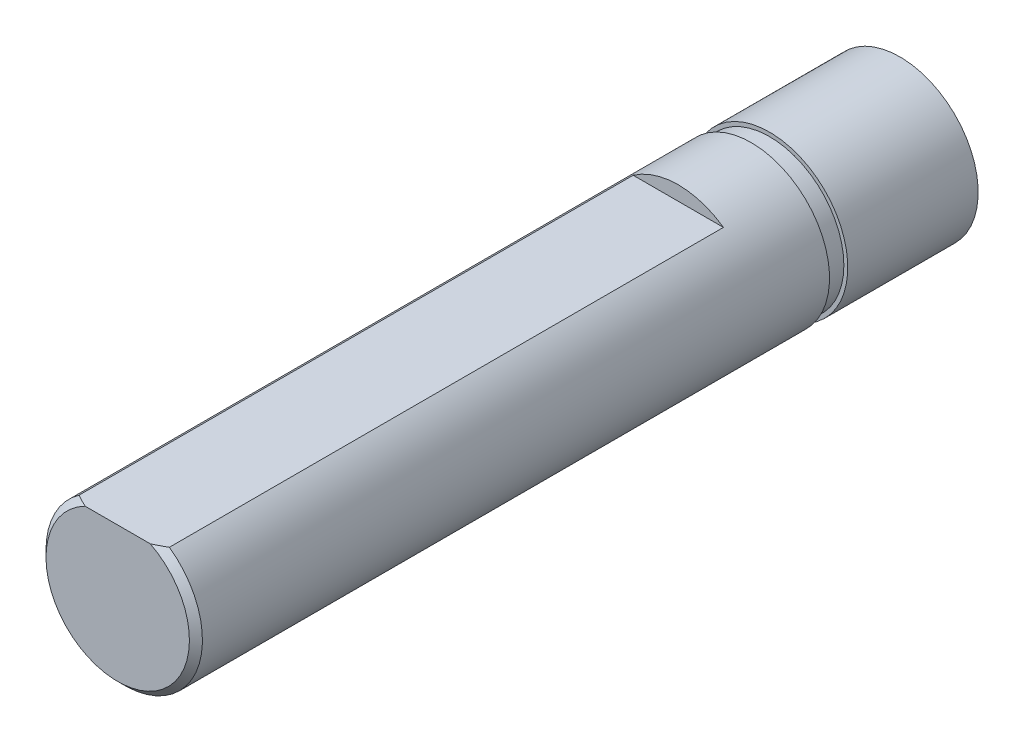
ISO-10303-21;
HEADER;
FILE_DESCRIPTION(('STEP AP214'),'2;1');
FILE_NAME('part.step','',(''),(''),'','','');
FILE_SCHEMA(('AUTOMOTIVE_DESIGN { 1 0 10303 214 1 1 1 1 }'));
ENDSEC;
DATA;
#1=APPLICATION_CONTEXT('core data for automotive mechanical design processes');
#2=APPLICATION_PROTOCOL_DEFINITION('international standard','automotive_design',2000,#1);
#3=PRODUCT_CONTEXT('',#1,'mechanical');
#4=PRODUCT('Part','Part','',(#3));
#5=PRODUCT_RELATED_PRODUCT_CATEGORY('part','',(#4));
#6=PRODUCT_DEFINITION_FORMATION('','',#4);
#7=PRODUCT_DEFINITION_CONTEXT('part definition',#1,'design');
#8=PRODUCT_DEFINITION('design','',#6,#7);
#9=PRODUCT_DEFINITION_SHAPE('','',#8);
#10=(LENGTH_UNIT() NAMED_UNIT(*) SI_UNIT(.MILLI.,.METRE.));
#11=(NAMED_UNIT(*) PLANE_ANGLE_UNIT() SI_UNIT($,.RADIAN.));
#12=(NAMED_UNIT(*) SI_UNIT($,.STERADIAN.) SOLID_ANGLE_UNIT());
#13=UNCERTAINTY_MEASURE_WITH_UNIT(LENGTH_MEASURE(1.E-05),#10,'distance_accuracy_value','');
#14=(GEOMETRIC_REPRESENTATION_CONTEXT(3) GLOBAL_UNCERTAINTY_ASSIGNED_CONTEXT((#13)) GLOBAL_UNIT_ASSIGNED_CONTEXT((#10,
#11,#12)) REPRESENTATION_CONTEXT('',''));
#15=CARTESIAN_POINT('',(0.,0.,0.));
#16=DIRECTION('',(0.,0.,1.));
#17=DIRECTION('',(1.,0.,0.));
#18=AXIS2_PLACEMENT_3D('',#15,#16,#17);
#19=CARTESIAN_POINT('',(0.,0.,0.));
#20=DIRECTION('',(0.,0.,1.));
#21=DIRECTION('',(1.,0.,0.));
#22=AXIS2_PLACEMENT_3D('',#19,#20,#21);
#23=PLANE('',#22);
#24=CARTESIAN_POINT('',(0.,0.,0.));
#25=DIRECTION('',(0.,0.,-1.));
#26=DIRECTION('',(-1.,0.,0.));
#27=AXIS2_PLACEMENT_3D('',#24,#25,#26);
#28=CIRCLE('',#27,3.);
#29=CARTESIAN_POINT('',(-3.,0.,0.));
#30=VERTEX_POINT('',#29);
#31=EDGE_CURVE('E20',#30,#30,#28,.F.);
#32=ORIENTED_EDGE('',*,*,#31,.F.);
#33=EDGE_LOOP('',(#32));
#34=FACE_BOUND('',#33,.T.);
#35=ADVANCED_FACE('F17',(#34),#23,.F.);
#36=CARTESIAN_POINT('',(0.,0.,30.));
#37=DIRECTION('',(0.,0.,-1.));
#38=DIRECTION('',(-1.,0.,0.));
#39=AXIS2_PLACEMENT_3D('',#36,#37,#38);
#40=CYLINDRICAL_SURFACE('',#39,3.);
#41=ORIENTED_EDGE('',*,*,#31,.T.);
#42=EDGE_LOOP('',(#41));
#43=FACE_BOUND('',#42,.T.);
#44=CARTESIAN_POINT('',(0.,0.,5.));
#45=DIRECTION('',(0.,0.,-1.));
#46=DIRECTION('',(-1.,0.,0.));
#47=AXIS2_PLACEMENT_3D('',#44,#45,#46);
#48=CIRCLE('',#47,3.);
#49=CARTESIAN_POINT('',(-3.,0.,5.));
#50=VERTEX_POINT('',#49);
#51=EDGE_CURVE('E131',#50,#50,#48,.T.);
#52=ORIENTED_EDGE('',*,*,#51,.T.);
#53=EDGE_LOOP('',(#52));
#54=FACE_BOUND('',#53,.T.);
#55=ADVANCED_FACE('F104',(#43,#54),#40,.T.);
#56=CARTESIAN_POINT('',(0.,-3.15,5.));
#57=DIRECTION('',(0.,0.,-1.));
#58=DIRECTION('',(-1.,0.,0.));
#59=AXIS2_PLACEMENT_3D('',#56,#57,#58);
#60=PLANE('',#59);
#61=CARTESIAN_POINT('',(0.,0.,5.));
#62=DIRECTION('',(0.,0.,1.));
#63=DIRECTION('',(1.,0.,0.));
#64=AXIS2_PLACEMENT_3D('',#61,#62,#63);
#65=CIRCLE('',#64,2.85);
#66=CARTESIAN_POINT('',(2.85,0.,5.));
#67=VERTEX_POINT('',#66);
#68=EDGE_CURVE('E129',#67,#67,#65,.T.);
#69=ORIENTED_EDGE('',*,*,#68,.F.);
#70=EDGE_LOOP('',(#69));
#71=FACE_BOUND('',#70,.T.);
#72=ORIENTED_EDGE('',*,*,#51,.F.);
#73=EDGE_LOOP('',(#72));
#74=FACE_BOUND('',#73,.T.);
#75=ADVANCED_FACE('F101',(#71,#74),#60,.F.);
#76=CARTESIAN_POINT('',(0.,0.,30.));
#77=DIRECTION('',(0.,0.,1.));
#78=DIRECTION('',(1.,0.,0.));
#79=AXIS2_PLACEMENT_3D('',#76,#77,#78);
#80=PLANE('',#79);
#81=CARTESIAN_POINT('',(0.,0.,29.9999999999159));
#82=DIRECTION('',(0.,0.,-1.));
#83=DIRECTION('',(-1.,0.,0.));
#84=AXIS2_PLACEMENT_3D('',#81,#82,#83);
#85=CIRCLE('',#84,2.74999999999181);
#86=CARTESIAN_POINT('',(1.24899959957632,2.44999999999629,29.9999999999579));
#87=VERTEX_POINT('',#86);
#88=CARTESIAN_POINT('',(-1.24899959957632,2.44999999999629,29.9999999999579));
#89=VERTEX_POINT('',#88);
#90=EDGE_CURVE('E69',#87,#89,#85,.T.);
#91=ORIENTED_EDGE('',*,*,#90,.F.);
#92=DIRECTION('',(1.,0.,0.));
#93=VECTOR('',#92,1.);
#94=CARTESIAN_POINT('',(-1.731328969318,2.45,30.));
#95=LINE('',#94,#93);
#96=EDGE_CURVE('E130',#87,#89,#95,.F.);
#97=ORIENTED_EDGE('',*,*,#96,.T.);
#98=EDGE_LOOP('',(#91,#97));
#99=FACE_BOUND('',#98,.T.);
#100=ADVANCED_FACE('F97',(#99),#80,.T.);
#101=CARTESIAN_POINT('',(0.,0.,0.));
#102=DIRECTION('',(0.,0.,1.));
#103=DIRECTION('',(1.,0.,0.));
#104=AXIS2_PLACEMENT_3D('',#101,#102,#103);
#105=CYLINDRICAL_SURFACE('',#104,2.85);
#106=CARTESIAN_POINT('',(0.,0.,5.7));
#107=DIRECTION('',(0.,0.,1.));
#108=DIRECTION('',(1.,0.,0.));
#109=AXIS2_PLACEMENT_3D('',#106,#107,#108);
#110=CIRCLE('',#109,2.85);
#111=CARTESIAN_POINT('',(2.85,0.,5.7));
#112=VERTEX_POINT('',#111);
#113=EDGE_CURVE('E66',#112,#112,#110,.F.);
#114=ORIENTED_EDGE('',*,*,#113,.T.);
#115=EDGE_LOOP('',(#114));
#116=FACE_BOUND('',#115,.T.);
#117=ORIENTED_EDGE('',*,*,#68,.T.);
#118=EDGE_LOOP('',(#117));
#119=FACE_BOUND('',#118,.T.);
#120=ADVANCED_FACE('F94',(#116,#119),#105,.T.);
#121=CARTESIAN_POINT('',(0.,0.,8.5));
#122=DIRECTION('',(0.,0.,1.));
#123=DIRECTION('',(1.,0.,0.));
#124=AXIS2_PLACEMENT_3D('',#121,#122,#123);
#125=PLANE('',#124);
#126=DIRECTION('',(1.,0.,0.));
#127=VECTOR('',#126,1.);
#128=CARTESIAN_POINT('',(-1.731328969318,2.45,8.5));
#129=LINE('',#128,#127);
#130=CARTESIAN_POINT('',(-1.73132896931805,2.45000000000002,8.5));
#131=VERTEX_POINT('',#130);
#132=CARTESIAN_POINT('',(1.73132896931805,2.45000000000002,8.5));
#133=VERTEX_POINT('',#132);
#134=EDGE_CURVE('E51',#131,#133,#129,.T.);
#135=ORIENTED_EDGE('',*,*,#134,.T.);
#136=CARTESIAN_POINT('',(0.,0.,8.5));
#137=DIRECTION('',(0.,0.,-1.));
#138=DIRECTION('',(-1.,0.,0.));
#139=AXIS2_PLACEMENT_3D('',#136,#137,#138);
#140=CIRCLE('',#139,3.);
#141=EDGE_CURVE('E62',#131,#133,#140,.T.);
#142=ORIENTED_EDGE('',*,*,#141,.F.);
#143=EDGE_LOOP('',(#135,#142));
#144=FACE_BOUND('',#143,.T.);
#145=ADVANCED_FACE('F63',(#144),#125,.T.);
#146=CARTESIAN_POINT('',(-1.731328969318,2.45,8.5));
#147=DIRECTION('',(0.,-1.,0.));
#148=DIRECTION('',(0.,0.,-1.));
#149=AXIS2_PLACEMENT_3D('',#146,#147,#148);
#150=PLANE('',#149);
#151=DIRECTION('',(0.,0.,-1.));
#152=VECTOR('',#151,1.);
#153=CARTESIAN_POINT('',(1.73132896931803,2.45000000000004,30.));
#154=LINE('',#153,#152);
#155=CARTESIAN_POINT('',(1.73132896932216,2.45000000000589,29.7499999999751));
#156=VERTEX_POINT('',#155);
#157=EDGE_CURVE('E56',#133,#156,#154,.F.);
#158=ORIENTED_EDGE('',*,*,#157,.F.);
#159=ORIENTED_EDGE('',*,*,#134,.F.);
#160=DIRECTION('',(0.,0.,-1.));
#161=VECTOR('',#160,1.);
#162=CARTESIAN_POINT('',(-1.73132896931803,2.45000000000004,30.));
#163=LINE('',#162,#161);
#164=CARTESIAN_POINT('',(-1.7313289693129,2.44999999999279,29.7499999999911));
#165=VERTEX_POINT('',#164);
#166=EDGE_CURVE('E55',#165,#131,#163,.T.);
#167=ORIENTED_EDGE('',*,*,#166,.F.);
#168=CARTESIAN_POINT('',(-1.248999599659,2.44999999995881,29.9999999999538));
#169=CARTESIAN_POINT('',(-1.26871399729352,2.44999997450651,29.9910459927995));
#170=CARTESIAN_POINT('',(-1.28836495833358,2.44999987100526,29.9819528210247));
#171=CARTESIAN_POINT('',(-1.32777965040594,2.44999962961844,29.9633907832963));
#172=CARTESIAN_POINT('',(-1.34754186782798,2.44999949133188,29.9539187023326));
#173=CARTESIAN_POINT('',(-1.38718763746759,2.44999930757596,29.9345989932173));
#174=CARTESIAN_POINT('',(-1.40706962293866,2.44999926328728,29.9247481523844));
#175=CARTESIAN_POINT('',(-1.44696313344482,2.44999926765276,29.9046708781911));
#176=CARTESIAN_POINT('',(-1.46697304885257,2.44999931750639,29.8944412478801));
#177=CARTESIAN_POINT('',(-1.50713015688331,2.44999946749274,29.8736063864109));
#178=CARTESIAN_POINT('',(-1.52727570540786,2.44999956827665,29.8629979880251));
#179=CARTESIAN_POINT('',(-1.5677113882859,2.44999975914034,29.8414055397389));
#180=CARTESIAN_POINT('',(-1.58799985233396,2.44999984905891,29.8304183631745));
#181=CARTESIAN_POINT('',(-1.62872824773105,2.44999996970029,29.8080683646185));
#182=CARTESIAN_POINT('',(-1.6491664901331,2.44999999960196,29.7967024667389));
#183=CARTESIAN_POINT('',(-1.69020090294024,2.45000002219302,29.7735947790332));
#184=CARTESIAN_POINT('',(-1.71079537262123,2.45000001436434,29.7618499682899));
#185=CARTESIAN_POINT('',(-1.73132896930778,2.44999999998553,29.7499999999823));
#186=B_SPLINE_CURVE_WITH_KNOTS('',3,(#168,#169,#170,#171,#172,#173,#174,#175,#176,#177,#178,
#179,#180,#181,#182,#183,#184,#185),.UNSPECIFIED.,.F.,.F.,(4,2,2,2,2,2,2,2,4),(0.,
0.0649567226490479,0.130699606030138,0.197263496213269,0.264681203149628,0.332983566119257,
0.402199523620987,0.472356186501054,0.543478913259393),.UNSPECIFIED.);
#187=EDGE_CURVE('E60',#89,#165,#186,.T.);
#188=ORIENTED_EDGE('',*,*,#187,.F.);
#189=ORIENTED_EDGE('',*,*,#96,.F.);
#190=CARTESIAN_POINT('',(1.73132896932629,2.45000000001174,29.7499999999502));
#191=CARTESIAN_POINT('',(1.71079537264322,2.45000001439018,29.7618499682561));
#192=CARTESIAN_POINT('',(1.69020090296565,2.45000002221869,29.7735947789976));
#193=CARTESIAN_POINT('',(1.64916649016435,2.44999999962754,29.7967024667002));
#194=CARTESIAN_POINT('',(1.62872824776469,2.44999996972597,29.8080683645785));
#195=CARTESIAN_POINT('',(1.58799985237138,2.44999984908501,29.8304183631323));
#196=CARTESIAN_POINT('',(1.56771138832471,2.44999975916675,29.8414055396957));
#197=CARTESIAN_POINT('',(1.52727570544843,2.44999956830382,29.8629979879806));
#198=CARTESIAN_POINT('',(1.50713015692426,2.44999946752037,29.8736063863659));
#199=CARTESIAN_POINT('',(1.46697304889331,2.44999931753501,29.8944412478346));
#200=CARTESIAN_POINT('',(1.44696313348497,2.44999926768191,29.9046708781456));
#201=CARTESIAN_POINT('',(1.40706962297666,2.44999926331751,29.9247481523393));
#202=CARTESIAN_POINT('',(1.38718763750404,2.44999930760673,29.9345989931726));
#203=CARTESIAN_POINT('',(1.34754186786038,2.44999949136367,29.9539187022892));
#204=CARTESIAN_POINT('',(1.32777965043585,2.44999962965071,29.9633907832537));
#205=CARTESIAN_POINT('',(1.28836495835759,2.44999987103838,29.9819528209842));
#206=CARTESIAN_POINT('',(1.26871399731412,2.44999997454,29.9910459927603));
#207=CARTESIAN_POINT('',(1.24899959967622,2.44999999999258,29.9999999999159));
#208=B_SPLINE_CURVE_WITH_KNOTS('',3,(#190,#191,#192,#193,#194,#195,#196,#197,#198,#199,#200,
#201,#202,#203,#204,#205,#206,#207),.UNSPECIFIED.,.F.,.F.,(4,2,2,2,2,2,2,2,4),(0.,
0.0711227267467542,0.141279389618583,0.210495347115379,0.278797710083342,0.346215417021251,
0.412779307209104,0.478522190598031,0.54347891325797),.UNSPECIFIED.);
#209=EDGE_CURVE('E59',#156,#87,#208,.T.);
#210=ORIENTED_EDGE('',*,*,#209,.F.);
#211=EDGE_LOOP('',(#158,#159,#167,#188,#189,#210));
#212=FACE_BOUND('',#211,.T.);
#213=ADVANCED_FACE('F53',(#212),#150,.F.);
#214=CARTESIAN_POINT('',(0.,0.,29.7500000000355));
#215=DIRECTION('',(0.,0.,-1.));
#216=DIRECTION('',(-1.,0.,0.));
#217=AXIS2_PLACEMENT_3D('',#214,#215,#216);
#218=CONICAL_SURFACE('',#217,2.99999999992906,0.785398163511135);
#219=CARTESIAN_POINT('',(0.,0.,29.75));
#220=DIRECTION('',(0.,0.,-1.));
#221=DIRECTION('',(-1.,0.,0.));
#222=AXIS2_PLACEMENT_3D('',#219,#220,#221);
#223=CIRCLE('',#222,3.);
#224=EDGE_CURVE('E26',#156,#165,#223,.T.);
#225=ORIENTED_EDGE('',*,*,#224,.F.);
#226=ORIENTED_EDGE('',*,*,#209,.T.);
#227=ORIENTED_EDGE('',*,*,#90,.T.);
#228=ORIENTED_EDGE('',*,*,#187,.T.);
#229=EDGE_LOOP('',(#225,#226,#227,#228));
#230=FACE_BOUND('',#229,.T.);
#231=ADVANCED_FACE('F77',(#230),#218,.T.);
#232=CARTESIAN_POINT('',(0.,-3.15,5.7));
#233=DIRECTION('',(0.,0.,1.));
#234=DIRECTION('',(1.,0.,0.));
#235=AXIS2_PLACEMENT_3D('',#232,#233,#234);
#236=PLANE('',#235);
#237=ORIENTED_EDGE('',*,*,#113,.F.);
#238=EDGE_LOOP('',(#237));
#239=FACE_BOUND('',#238,.T.);
#240=CARTESIAN_POINT('',(0.,0.,5.7));
#241=DIRECTION('',(0.,0.,-1.));
#242=DIRECTION('',(-1.,0.,0.));
#243=AXIS2_PLACEMENT_3D('',#240,#241,#242);
#244=CIRCLE('',#243,3.);
#245=CARTESIAN_POINT('',(-3.,0.,5.7));
#246=VERTEX_POINT('',#245);
#247=EDGE_CURVE('E11',#246,#246,#244,.F.);
#248=ORIENTED_EDGE('',*,*,#247,.F.);
#249=EDGE_LOOP('',(#248));
#250=FACE_BOUND('',#249,.T.);
#251=ADVANCED_FACE('F87',(#239,#250),#236,.F.);
#252=CARTESIAN_POINT('',(0.,0.,30.));
#253=DIRECTION('',(0.,0.,-1.));
#254=DIRECTION('',(-1.,0.,0.));
#255=AXIS2_PLACEMENT_3D('',#252,#253,#254);
#256=CYLINDRICAL_SURFACE('',#255,3.);
#257=ORIENTED_EDGE('',*,*,#247,.T.);
#258=EDGE_LOOP('',(#257));
#259=FACE_BOUND('',#258,.T.);
#260=ORIENTED_EDGE('',*,*,#224,.T.);
#261=ORIENTED_EDGE('',*,*,#166,.T.);
#262=ORIENTED_EDGE('',*,*,#141,.T.);
#263=ORIENTED_EDGE('',*,*,#157,.T.);
#264=EDGE_LOOP('',(#260,#261,#262,#263));
#265=FACE_BOUND('',#264,.T.);
#266=ADVANCED_FACE('F65',(#259,#265),#256,.T.);
#267=CLOSED_SHELL('',(#35,#55,#75,#100,#120,#145,#213,#231,#251,#266));
#268=MANIFOLD_SOLID_BREP('B1',#267);
#269=ADVANCED_BREP_SHAPE_REPRESENTATION('',(#18,#268),#14);
#270=SHAPE_DEFINITION_REPRESENTATION(#9,#269);
ENDSEC;
END-ISO-10303-21;
